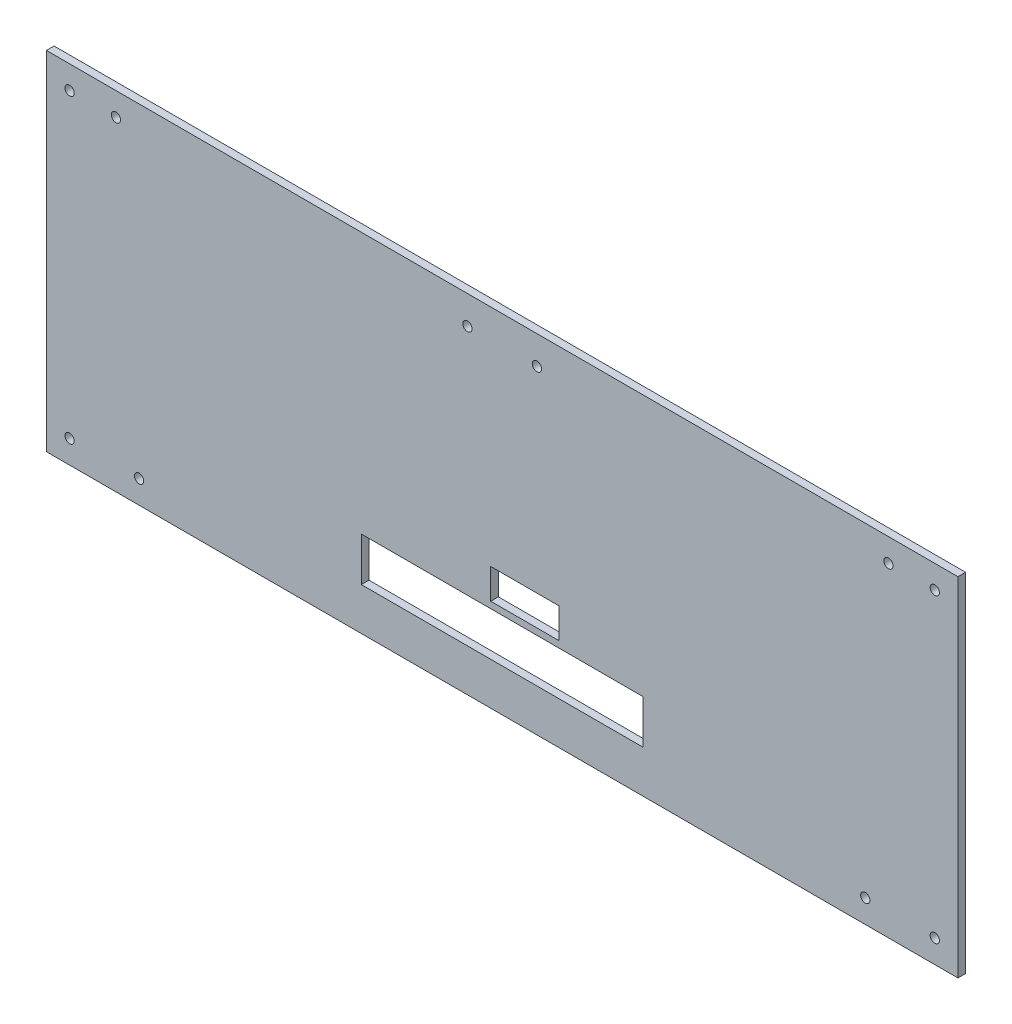
ISO-10303-21;
HEADER;
FILE_DESCRIPTION(('STEP AP214'),'2;1');
FILE_NAME('part.step','',(''),(''),'','','');
FILE_SCHEMA(('AUTOMOTIVE_DESIGN { 1 0 10303 214 1 1 1 1 }'));
ENDSEC;
DATA;
#1=APPLICATION_CONTEXT('core data for automotive mechanical design processes');
#2=APPLICATION_PROTOCOL_DEFINITION('international standard','automotive_design',2000,#1);
#3=PRODUCT_CONTEXT('',#1,'mechanical');
#4=PRODUCT('Part','Part','',(#3));
#5=PRODUCT_RELATED_PRODUCT_CATEGORY('part','',(#4));
#6=PRODUCT_DEFINITION_FORMATION('','',#4);
#7=PRODUCT_DEFINITION_CONTEXT('part definition',#1,'design');
#8=PRODUCT_DEFINITION('design','',#6,#7);
#9=PRODUCT_DEFINITION_SHAPE('','',#8);
#10=(LENGTH_UNIT() NAMED_UNIT(*) SI_UNIT(.MILLI.,.METRE.));
#11=(NAMED_UNIT(*) PLANE_ANGLE_UNIT() SI_UNIT($,.RADIAN.));
#12=(NAMED_UNIT(*) SI_UNIT($,.STERADIAN.) SOLID_ANGLE_UNIT());
#13=UNCERTAINTY_MEASURE_WITH_UNIT(LENGTH_MEASURE(1.E-05),#10,'distance_accuracy_value','');
#14=(GEOMETRIC_REPRESENTATION_CONTEXT(3) GLOBAL_UNCERTAINTY_ASSIGNED_CONTEXT((#13)) GLOBAL_UNIT_ASSIGNED_CONTEXT((#10,
#11,#12)) REPRESENTATION_CONTEXT('',''));
#15=CARTESIAN_POINT('',(0.,0.,0.));
#16=DIRECTION('',(0.,0.,1.));
#17=DIRECTION('',(1.,0.,0.));
#18=AXIS2_PLACEMENT_3D('',#15,#16,#17);
#19=CARTESIAN_POINT('',(-169.699999999996,24.5,3.3));
#20=DIRECTION('',(1.,0.,0.));
#21=DIRECTION('',(0.,1.,0.));
#22=AXIS2_PLACEMENT_3D('',#19,#20,#21);
#23=PLANE('',#22);
#24=DIRECTION('',(0.,-1.,0.));
#25=VECTOR('',#24,1.);
#26=CARTESIAN_POINT('',(-169.699999999996,24.5,0.));
#27=LINE('',#26,#25);
#28=CARTESIAN_POINT('',(-169.699999999996,24.5,0.));
#29=VERTEX_POINT('',#28);
#30=CARTESIAN_POINT('',(-169.699999999996,-125.5,0.));
#31=VERTEX_POINT('',#30);
#32=EDGE_CURVE('E230',#29,#31,#27,.T.);
#33=ORIENTED_EDGE('',*,*,#32,.T.);
#34=DIRECTION('',(0.,0.,-1.));
#35=VECTOR('',#34,1.);
#36=CARTESIAN_POINT('',(-169.699999999996,-125.5,3.3));
#37=LINE('',#36,#35);
#38=CARTESIAN_POINT('',(-169.699999999996,-125.5,3.3));
#39=VERTEX_POINT('',#38);
#40=EDGE_CURVE('E11',#39,#31,#37,.T.);
#41=ORIENTED_EDGE('',*,*,#40,.F.);
#42=DIRECTION('',(0.,-1.,0.));
#43=VECTOR('',#42,1.);
#44=CARTESIAN_POINT('',(-169.699999999996,24.5,3.3));
#45=LINE('',#44,#43);
#46=CARTESIAN_POINT('',(-169.699999999996,24.5,3.3));
#47=VERTEX_POINT('',#46);
#48=EDGE_CURVE('E233',#47,#39,#45,.T.);
#49=ORIENTED_EDGE('',*,*,#48,.F.);
#50=DIRECTION('',(0.,0.,-1.));
#51=VECTOR('',#50,1.);
#52=CARTESIAN_POINT('',(-169.699999999996,24.5,3.3));
#53=LINE('',#52,#51);
#54=EDGE_CURVE('E243',#47,#29,#53,.T.);
#55=ORIENTED_EDGE('',*,*,#54,.T.);
#56=EDGE_LOOP('',(#33,#41,#49,#55));
#57=FACE_BOUND('',#56,.T.);
#58=ADVANCED_FACE('F33',(#57),#23,.F.);
#59=CARTESIAN_POINT('',(-169.699999999996,-125.5,3.3));
#60=DIRECTION('',(0.,1.,0.));
#61=DIRECTION('',(0.,0.,1.));
#62=AXIS2_PLACEMENT_3D('',#59,#60,#61);
#63=PLANE('',#62);
#64=DIRECTION('',(1.,0.,0.));
#65=VECTOR('',#64,1.);
#66=CARTESIAN_POINT('',(-169.699999999996,-125.5,0.));
#67=LINE('',#66,#65);
#68=CARTESIAN_POINT('',(223.700000000004,-125.5,0.));
#69=VERTEX_POINT('',#68);
#70=EDGE_CURVE('E246',#31,#69,#67,.T.);
#71=ORIENTED_EDGE('',*,*,#70,.T.);
#72=DIRECTION('',(0.,0.,-1.));
#73=VECTOR('',#72,1.);
#74=CARTESIAN_POINT('',(223.700000000004,-125.5,3.3));
#75=LINE('',#74,#73);
#76=CARTESIAN_POINT('',(223.700000000004,-125.5,3.3));
#77=VERTEX_POINT('',#76);
#78=EDGE_CURVE('E41',#77,#69,#75,.T.);
#79=ORIENTED_EDGE('',*,*,#78,.F.);
#80=DIRECTION('',(1.,0.,0.));
#81=VECTOR('',#80,1.);
#82=CARTESIAN_POINT('',(-169.699999999996,-125.5,3.3));
#83=LINE('',#82,#81);
#84=EDGE_CURVE('E236',#39,#77,#83,.T.);
#85=ORIENTED_EDGE('',*,*,#84,.F.);
#86=ORIENTED_EDGE('',*,*,#40,.T.);
#87=EDGE_LOOP('',(#71,#79,#85,#86));
#88=FACE_BOUND('',#87,.T.);
#89=ADVANCED_FACE('F291',(#88),#63,.F.);
#90=CARTESIAN_POINT('',(223.700000000004,24.5,3.3));
#91=DIRECTION('',(-1.,0.,0.));
#92=DIRECTION('',(0.,-1.,0.));
#93=AXIS2_PLACEMENT_3D('',#90,#91,#92);
#94=PLANE('',#93);
#95=DIRECTION('',(0.,1.,0.));
#96=VECTOR('',#95,1.);
#97=CARTESIAN_POINT('',(223.700000000004,24.5,0.));
#98=LINE('',#97,#96);
#99=CARTESIAN_POINT('',(223.700000000004,24.5,0.));
#100=VERTEX_POINT('',#99);
#101=EDGE_CURVE('E248',#69,#100,#98,.T.);
#102=ORIENTED_EDGE('',*,*,#101,.T.);
#103=DIRECTION('',(0.,0.,-1.));
#104=VECTOR('',#103,1.);
#105=CARTESIAN_POINT('',(223.700000000004,24.5,3.3));
#106=LINE('',#105,#104);
#107=CARTESIAN_POINT('',(223.700000000004,24.5,3.3));
#108=VERTEX_POINT('',#107);
#109=EDGE_CURVE('E253',#108,#100,#106,.T.);
#110=ORIENTED_EDGE('',*,*,#109,.F.);
#111=DIRECTION('',(0.,1.,0.));
#112=VECTOR('',#111,1.);
#113=CARTESIAN_POINT('',(223.700000000004,24.5,3.3));
#114=LINE('',#113,#112);
#115=EDGE_CURVE('E239',#77,#108,#114,.T.);
#116=ORIENTED_EDGE('',*,*,#115,.F.);
#117=ORIENTED_EDGE('',*,*,#78,.T.);
#118=EDGE_LOOP('',(#102,#110,#116,#117));
#119=FACE_BOUND('',#118,.T.);
#120=ADVANCED_FACE('F296',(#119),#94,.F.);
#121=CARTESIAN_POINT('',(-169.699999999996,24.5,3.3));
#122=DIRECTION('',(0.,-1.,0.));
#123=DIRECTION('',(0.,0.,-1.));
#124=AXIS2_PLACEMENT_3D('',#121,#122,#123);
#125=PLANE('',#124);
#126=DIRECTION('',(-1.,0.,0.));
#127=VECTOR('',#126,1.);
#128=CARTESIAN_POINT('',(-169.699999999996,24.5,0.));
#129=LINE('',#128,#127);
#130=EDGE_CURVE('E237',#100,#29,#129,.T.);
#131=ORIENTED_EDGE('',*,*,#130,.T.);
#132=ORIENTED_EDGE('',*,*,#54,.F.);
#133=DIRECTION('',(-1.,0.,0.));
#134=VECTOR('',#133,1.);
#135=CARTESIAN_POINT('',(-169.699999999996,24.5,3.3));
#136=LINE('',#135,#134);
#137=EDGE_CURVE('E241',#108,#47,#136,.T.);
#138=ORIENTED_EDGE('',*,*,#137,.F.);
#139=ORIENTED_EDGE('',*,*,#109,.T.);
#140=EDGE_LOOP('',(#131,#132,#138,#139));
#141=FACE_BOUND('',#140,.T.);
#142=ADVANCED_FACE('F312',(#141),#125,.F.);
#143=CARTESIAN_POINT('',(0.,0.,3.3));
#144=DIRECTION('',(0.,0.,1.));
#145=DIRECTION('',(1.,0.,0.));
#146=AXIS2_PLACEMENT_3D('',#143,#144,#145);
#147=PLANE('',#146);
#148=DIRECTION('',(0.,1.,0.));
#149=VECTOR('',#148,1.);
#150=CARTESIAN_POINT('',(51.5500000000044,0.,3.3));
#151=LINE('',#150,#149);
#152=CARTESIAN_POINT('',(51.5500000000044,-85.4999999999981,3.3));
#153=VERTEX_POINT('',#152);
#154=CARTESIAN_POINT('',(51.5500000000044,-72.4999999999981,3.3));
#155=VERTEX_POINT('',#154);
#156=EDGE_CURVE('E185',#153,#155,#151,.T.);
#157=ORIENTED_EDGE('',*,*,#156,.F.);
#158=DIRECTION('',(1.,0.,0.));
#159=VECTOR('',#158,1.);
#160=CARTESIAN_POINT('',(0.,-85.4999999999981,3.3));
#161=LINE('',#160,#159);
#162=CARTESIAN_POINT('',(22.0500000000044,-85.4999999999981,3.3));
#163=VERTEX_POINT('',#162);
#164=EDGE_CURVE('E180',#163,#153,#161,.T.);
#165=ORIENTED_EDGE('',*,*,#164,.F.);
#166=DIRECTION('',(0.,-1.,0.));
#167=VECTOR('',#166,1.);
#168=CARTESIAN_POINT('',(22.0500000000044,0.,3.3));
#169=LINE('',#168,#167);
#170=CARTESIAN_POINT('',(22.0500000000044,-72.4999999999981,3.3));
#171=VERTEX_POINT('',#170);
#172=EDGE_CURVE('E128',#171,#163,#169,.T.);
#173=ORIENTED_EDGE('',*,*,#172,.F.);
#174=DIRECTION('',(-1.,0.,0.));
#175=VECTOR('',#174,1.);
#176=CARTESIAN_POINT('',(0.,-72.4999999999981,3.3));
#177=LINE('',#176,#175);
#178=EDGE_CURVE('E183',#155,#171,#177,.T.);
#179=ORIENTED_EDGE('',*,*,#178,.F.);
#180=EDGE_LOOP('',(#157,#165,#173,#179));
#181=FACE_BOUND('',#180,.T.);
#182=DIRECTION('',(0.,1.,0.));
#183=VECTOR('',#182,1.);
#184=CARTESIAN_POINT('',(87.7897237376353,0.,3.3));
#185=LINE('',#184,#183);
#186=CARTESIAN_POINT('',(87.7897237376353,-107.192382112363,3.3));
#187=VERTEX_POINT('',#186);
#188=CARTESIAN_POINT('',(87.7897237376353,-88.292382112363,3.3));
#189=VERTEX_POINT('',#188);
#190=EDGE_CURVE('E178',#187,#189,#185,.T.);
#191=ORIENTED_EDGE('',*,*,#190,.F.);
#192=DIRECTION('',(1.,0.,0.));
#193=VECTOR('',#192,1.);
#194=CARTESIAN_POINT('',(0.,-107.192382112363,3.3));
#195=LINE('',#194,#193);
#196=CARTESIAN_POINT('',(-33.7897237376264,-107.192382112363,3.3));
#197=VERTEX_POINT('',#196);
#198=EDGE_CURVE('E152',#197,#187,#195,.T.);
#199=ORIENTED_EDGE('',*,*,#198,.F.);
#200=DIRECTION('',(0.,-1.,0.));
#201=VECTOR('',#200,1.);
#202=CARTESIAN_POINT('',(-33.7897237376264,0.,3.3));
#203=LINE('',#202,#201);
#204=CARTESIAN_POINT('',(-33.7897237376264,-88.292382112363,3.3));
#205=VERTEX_POINT('',#204);
#206=EDGE_CURVE('E174',#205,#197,#203,.T.);
#207=ORIENTED_EDGE('',*,*,#206,.F.);
#208=DIRECTION('',(-1.,0.,0.));
#209=VECTOR('',#208,1.);
#210=CARTESIAN_POINT('',(0.,-88.292382112363,3.3));
#211=LINE('',#210,#209);
#212=EDGE_CURVE('E176',#189,#205,#211,.T.);
#213=ORIENTED_EDGE('',*,*,#212,.F.);
#214=EDGE_LOOP('',(#191,#199,#207,#213));
#215=FACE_BOUND('',#214,.T.);
#216=CARTESIAN_POINT('',(12.,12.2500000000001,3.3));
#217=DIRECTION('',(0.,0.,1.));
#218=DIRECTION('',(1.,0.,0.));
#219=AXIS2_PLACEMENT_3D('',#216,#217,#218);
#220=CIRCLE('',#219,2.);
#221=CARTESIAN_POINT('',(14.,12.2500000000001,3.3));
#222=VERTEX_POINT('',#221);
#223=EDGE_CURVE('E188',#222,#222,#220,.T.);
#224=ORIENTED_EDGE('',*,*,#223,.F.);
#225=EDGE_LOOP('',(#224));
#226=FACE_BOUND('',#225,.T.);
#227=CARTESIAN_POINT('',(42.,12.25,3.3));
#228=DIRECTION('',(0.,0.,1.));
#229=DIRECTION('',(-1.,0.,0.));
#230=AXIS2_PLACEMENT_3D('',#227,#228,#229);
#231=CIRCLE('',#230,2.);
#232=CARTESIAN_POINT('',(40.,12.25,3.3));
#233=VERTEX_POINT('',#232);
#234=EDGE_CURVE('E187',#233,#233,#231,.T.);
#235=ORIENTED_EDGE('',*,*,#234,.F.);
#236=EDGE_LOOP('',(#235));
#237=FACE_BOUND('',#236,.T.);
#238=CARTESIAN_POINT('',(-159.699999999996,14.5,3.3));
#239=DIRECTION('',(0.,0.,1.));
#240=DIRECTION('',(1.,0.,0.));
#241=AXIS2_PLACEMENT_3D('',#238,#239,#240);
#242=CIRCLE('',#241,2.);
#243=CARTESIAN_POINT('',(-157.699999999996,14.5,3.3));
#244=VERTEX_POINT('',#243);
#245=EDGE_CURVE('E194',#244,#244,#242,.T.);
#246=ORIENTED_EDGE('',*,*,#245,.F.);
#247=EDGE_LOOP('',(#246));
#248=FACE_BOUND('',#247,.T.);
#249=CARTESIAN_POINT('',(-139.699999999996,14.5,3.3));
#250=DIRECTION('',(0.,0.,1.));
#251=DIRECTION('',(1.,0.,0.));
#252=AXIS2_PLACEMENT_3D('',#249,#250,#251);
#253=CIRCLE('',#252,2.);
#254=CARTESIAN_POINT('',(-137.699999999996,14.5,3.3));
#255=VERTEX_POINT('',#254);
#256=EDGE_CURVE('E198',#255,#255,#253,.T.);
#257=ORIENTED_EDGE('',*,*,#256,.F.);
#258=EDGE_LOOP('',(#257));
#259=FACE_BOUND('',#258,.T.);
#260=CARTESIAN_POINT('',(193.700000000004,14.5,3.3));
#261=DIRECTION('',(0.,0.,1.));
#262=DIRECTION('',(-1.,0.,0.));
#263=AXIS2_PLACEMENT_3D('',#260,#261,#262);
#264=CIRCLE('',#263,2.);
#265=CARTESIAN_POINT('',(191.700000000004,14.5,3.3));
#266=VERTEX_POINT('',#265);
#267=EDGE_CURVE('E201',#266,#266,#264,.T.);
#268=ORIENTED_EDGE('',*,*,#267,.F.);
#269=EDGE_LOOP('',(#268));
#270=FACE_BOUND('',#269,.T.);
#271=CARTESIAN_POINT('',(213.700000000004,14.5,3.3));
#272=DIRECTION('',(0.,0.,1.));
#273=DIRECTION('',(-1.,0.,0.));
#274=AXIS2_PLACEMENT_3D('',#271,#272,#273);
#275=CIRCLE('',#274,2.);
#276=CARTESIAN_POINT('',(211.700000000004,14.5,3.3));
#277=VERTEX_POINT('',#276);
#278=EDGE_CURVE('E204',#277,#277,#275,.T.);
#279=ORIENTED_EDGE('',*,*,#278,.F.);
#280=EDGE_LOOP('',(#279));
#281=FACE_BOUND('',#280,.T.);
#282=CARTESIAN_POINT('',(-159.699999999995,-115.5,3.3));
#283=DIRECTION('',(0.,0.,-1.));
#284=DIRECTION('',(-1.,0.,0.));
#285=AXIS2_PLACEMENT_3D('',#282,#283,#284);
#286=CIRCLE('',#285,2.);
#287=CARTESIAN_POINT('',(-161.699999999995,-115.5,3.3));
#288=VERTEX_POINT('',#287);
#289=EDGE_CURVE('E220',#288,#288,#286,.T.);
#290=ORIENTED_EDGE('',*,*,#289,.T.);
#291=EDGE_LOOP('',(#290));
#292=FACE_BOUND('',#291,.T.);
#293=CARTESIAN_POINT('',(-129.699999999995,-115.5,3.3));
#294=DIRECTION('',(0.,0.,-1.));
#295=DIRECTION('',(-1.,0.,0.));
#296=AXIS2_PLACEMENT_3D('',#293,#294,#295);
#297=CIRCLE('',#296,2.);
#298=CARTESIAN_POINT('',(-131.699999999995,-115.5,3.3));
#299=VERTEX_POINT('',#298);
#300=EDGE_CURVE('E214',#299,#299,#297,.T.);
#301=ORIENTED_EDGE('',*,*,#300,.T.);
#302=EDGE_LOOP('',(#301));
#303=FACE_BOUND('',#302,.T.);
#304=CARTESIAN_POINT('',(213.700000000004,-115.5,3.3));
#305=DIRECTION('',(0.,0.,-1.));
#306=DIRECTION('',(-1.,0.,0.));
#307=AXIS2_PLACEMENT_3D('',#304,#305,#306);
#308=CIRCLE('',#307,2.00000000000003);
#309=CARTESIAN_POINT('',(211.700000000004,-115.5,3.3));
#310=VERTEX_POINT('',#309);
#311=EDGE_CURVE('E207',#310,#310,#308,.T.);
#312=ORIENTED_EDGE('',*,*,#311,.T.);
#313=EDGE_LOOP('',(#312));
#314=FACE_BOUND('',#313,.T.);
#315=CARTESIAN_POINT('',(183.700000000004,-115.5,3.3));
#316=DIRECTION('',(0.,0.,-1.));
#317=DIRECTION('',(-1.,0.,0.));
#318=AXIS2_PLACEMENT_3D('',#315,#316,#317);
#319=CIRCLE('',#318,2.00000000000002);
#320=CARTESIAN_POINT('',(181.700000000004,-115.5,3.3));
#321=VERTEX_POINT('',#320);
#322=EDGE_CURVE('E227',#321,#321,#319,.T.);
#323=ORIENTED_EDGE('',*,*,#322,.T.);
#324=EDGE_LOOP('',(#323));
#325=FACE_BOUND('',#324,.T.);
#326=ORIENTED_EDGE('',*,*,#48,.T.);
#327=ORIENTED_EDGE('',*,*,#84,.T.);
#328=ORIENTED_EDGE('',*,*,#115,.T.);
#329=ORIENTED_EDGE('',*,*,#137,.T.);
#330=EDGE_LOOP('',(#326,#327,#328,#329));
#331=FACE_BOUND('',#330,.T.);
#332=ADVANCED_FACE('F308',(#181,#215,#226,#237,#248,#259,#270,#281,#292,#303,#314,#325,#331),
#147,.T.);
#333=CARTESIAN_POINT('',(0.,0.,0.));
#334=DIRECTION('',(0.,0.,1.));
#335=DIRECTION('',(1.,0.,0.));
#336=AXIS2_PLACEMENT_3D('',#333,#334,#335);
#337=PLANE('',#336);
#338=DIRECTION('',(-1.,0.,0.));
#339=VECTOR('',#338,1.);
#340=CARTESIAN_POINT('',(51.5500000000044,-85.4999999999981,0.));
#341=LINE('',#340,#339);
#342=CARTESIAN_POINT('',(51.5500000000044,-85.4999999999981,0.));
#343=VERTEX_POINT('',#342);
#344=CARTESIAN_POINT('',(22.0500000000044,-85.4999999999981,0.));
#345=VERTEX_POINT('',#344);
#346=EDGE_CURVE('E135',#343,#345,#341,.T.);
#347=ORIENTED_EDGE('',*,*,#346,.F.);
#348=DIRECTION('',(0.,-1.,0.));
#349=VECTOR('',#348,1.);
#350=CARTESIAN_POINT('',(51.5500000000044,-72.4999999999981,0.));
#351=LINE('',#350,#349);
#352=CARTESIAN_POINT('',(51.5500000000044,-72.4999999999981,0.));
#353=VERTEX_POINT('',#352);
#354=EDGE_CURVE('E140',#353,#343,#351,.T.);
#355=ORIENTED_EDGE('',*,*,#354,.F.);
#356=DIRECTION('',(1.,0.,0.));
#357=VECTOR('',#356,1.);
#358=CARTESIAN_POINT('',(51.5500000000044,-72.4999999999981,0.));
#359=LINE('',#358,#357);
#360=CARTESIAN_POINT('',(22.0500000000044,-72.4999999999981,0.));
#361=VERTEX_POINT('',#360);
#362=EDGE_CURVE('E145',#361,#353,#359,.T.);
#363=ORIENTED_EDGE('',*,*,#362,.F.);
#364=DIRECTION('',(0.,1.,0.));
#365=VECTOR('',#364,1.);
#366=CARTESIAN_POINT('',(22.0500000000044,-72.4999999999981,0.));
#367=LINE('',#366,#365);
#368=EDGE_CURVE('E125',#345,#361,#367,.T.);
#369=ORIENTED_EDGE('',*,*,#368,.F.);
#370=EDGE_LOOP('',(#347,#355,#363,#369));
#371=FACE_BOUND('',#370,.T.);
#372=DIRECTION('',(-1.,0.,0.));
#373=VECTOR('',#372,1.);
#374=CARTESIAN_POINT('',(87.7897237376353,-107.192382112363,0.));
#375=LINE('',#374,#373);
#376=CARTESIAN_POINT('',(87.7897237376353,-107.192382112363,0.));
#377=VERTEX_POINT('',#376);
#378=CARTESIAN_POINT('',(-33.7897237376264,-107.192382112363,0.));
#379=VERTEX_POINT('',#378);
#380=EDGE_CURVE('E157',#377,#379,#375,.T.);
#381=ORIENTED_EDGE('',*,*,#380,.F.);
#382=DIRECTION('',(0.,-1.,0.));
#383=VECTOR('',#382,1.);
#384=CARTESIAN_POINT('',(87.7897237376353,-88.292382112363,0.));
#385=LINE('',#384,#383);
#386=CARTESIAN_POINT('',(87.7897237376353,-88.292382112363,0.));
#387=VERTEX_POINT('',#386);
#388=EDGE_CURVE('E155',#387,#377,#385,.T.);
#389=ORIENTED_EDGE('',*,*,#388,.F.);
#390=DIRECTION('',(1.,0.,0.));
#391=VECTOR('',#390,1.);
#392=CARTESIAN_POINT('',(87.7897237376353,-88.292382112363,0.));
#393=LINE('',#392,#391);
#394=CARTESIAN_POINT('',(-33.7897237376264,-88.292382112363,0.));
#395=VERTEX_POINT('',#394);
#396=EDGE_CURVE('E162',#395,#387,#393,.T.);
#397=ORIENTED_EDGE('',*,*,#396,.F.);
#398=DIRECTION('',(0.,1.,0.));
#399=VECTOR('',#398,1.);
#400=CARTESIAN_POINT('',(-33.7897237376264,-88.292382112363,0.));
#401=LINE('',#400,#399);
#402=EDGE_CURVE('E159',#379,#395,#401,.T.);
#403=ORIENTED_EDGE('',*,*,#402,.F.);
#404=EDGE_LOOP('',(#381,#389,#397,#403));
#405=FACE_BOUND('',#404,.T.);
#406=CARTESIAN_POINT('',(12.,12.2500000000001,0.));
#407=DIRECTION('',(0.,0.,1.));
#408=DIRECTION('',(1.,0.,0.));
#409=AXIS2_PLACEMENT_3D('',#406,#407,#408);
#410=CIRCLE('',#409,2.);
#411=CARTESIAN_POINT('',(14.,12.2500000000001,0.));
#412=VERTEX_POINT('',#411);
#413=EDGE_CURVE('E36',#412,#412,#410,.T.);
#414=ORIENTED_EDGE('',*,*,#413,.T.);
#415=EDGE_LOOP('',(#414));
#416=FACE_BOUND('',#415,.T.);
#417=CARTESIAN_POINT('',(42.,12.25,0.));
#418=DIRECTION('',(0.,0.,1.));
#419=DIRECTION('',(1.,0.,0.));
#420=AXIS2_PLACEMENT_3D('',#417,#418,#419);
#421=CIRCLE('',#420,2.);
#422=CARTESIAN_POINT('',(44.,12.25,0.));
#423=VERTEX_POINT('',#422);
#424=EDGE_CURVE('E191',#423,#423,#421,.T.);
#425=ORIENTED_EDGE('',*,*,#424,.T.);
#426=EDGE_LOOP('',(#425));
#427=FACE_BOUND('',#426,.T.);
#428=CARTESIAN_POINT('',(-159.699999999996,14.5,0.));
#429=DIRECTION('',(0.,0.,1.));
#430=DIRECTION('',(1.,0.,0.));
#431=AXIS2_PLACEMENT_3D('',#428,#429,#430);
#432=CIRCLE('',#431,2.);
#433=CARTESIAN_POINT('',(-157.699999999996,14.5,0.));
#434=VERTEX_POINT('',#433);
#435=EDGE_CURVE('E226',#434,#434,#432,.T.);
#436=ORIENTED_EDGE('',*,*,#435,.T.);
#437=EDGE_LOOP('',(#436));
#438=FACE_BOUND('',#437,.T.);
#439=CARTESIAN_POINT('',(-139.699999999996,14.5,0.));
#440=DIRECTION('',(0.,0.,1.));
#441=DIRECTION('',(1.,0.,0.));
#442=AXIS2_PLACEMENT_3D('',#439,#440,#441);
#443=CIRCLE('',#442,2.);
#444=CARTESIAN_POINT('',(-137.699999999996,14.5,0.));
#445=VERTEX_POINT('',#444);
#446=EDGE_CURVE('E263',#445,#445,#443,.T.);
#447=ORIENTED_EDGE('',*,*,#446,.T.);
#448=EDGE_LOOP('',(#447));
#449=FACE_BOUND('',#448,.T.);
#450=CARTESIAN_POINT('',(193.700000000004,14.5,0.));
#451=DIRECTION('',(0.,0.,1.));
#452=DIRECTION('',(1.,0.,0.));
#453=AXIS2_PLACEMENT_3D('',#450,#451,#452);
#454=CIRCLE('',#453,2.);
#455=CARTESIAN_POINT('',(195.700000000004,14.5,0.));
#456=VERTEX_POINT('',#455);
#457=EDGE_CURVE('E260',#456,#456,#454,.T.);
#458=ORIENTED_EDGE('',*,*,#457,.T.);
#459=EDGE_LOOP('',(#458));
#460=FACE_BOUND('',#459,.T.);
#461=CARTESIAN_POINT('',(213.700000000004,14.5,0.));
#462=DIRECTION('',(0.,0.,1.));
#463=DIRECTION('',(1.,0.,0.));
#464=AXIS2_PLACEMENT_3D('',#461,#462,#463);
#465=CIRCLE('',#464,2.);
#466=CARTESIAN_POINT('',(215.700000000004,14.5,0.));
#467=VERTEX_POINT('',#466);
#468=EDGE_CURVE('E197',#467,#467,#465,.T.);
#469=ORIENTED_EDGE('',*,*,#468,.T.);
#470=EDGE_LOOP('',(#469));
#471=FACE_BOUND('',#470,.T.);
#472=CARTESIAN_POINT('',(-159.699999999995,-115.5,0.));
#473=DIRECTION('',(0.,0.,-1.));
#474=DIRECTION('',(-1.,0.,0.));
#475=AXIS2_PLACEMENT_3D('',#472,#473,#474);
#476=CIRCLE('',#475,2.);
#477=CARTESIAN_POINT('',(-161.699999999995,-115.5,0.));
#478=VERTEX_POINT('',#477);
#479=EDGE_CURVE('E223',#478,#478,#476,.T.);
#480=ORIENTED_EDGE('',*,*,#479,.F.);
#481=EDGE_LOOP('',(#480));
#482=FACE_BOUND('',#481,.T.);
#483=CARTESIAN_POINT('',(-129.699999999995,-115.5,0.));
#484=DIRECTION('',(0.,0.,-1.));
#485=DIRECTION('',(-1.,0.,0.));
#486=AXIS2_PLACEMENT_3D('',#483,#484,#485);
#487=CIRCLE('',#486,2.);
#488=CARTESIAN_POINT('',(-131.699999999995,-115.5,0.));
#489=VERTEX_POINT('',#488);
#490=EDGE_CURVE('E217',#489,#489,#487,.T.);
#491=ORIENTED_EDGE('',*,*,#490,.F.);
#492=EDGE_LOOP('',(#491));
#493=FACE_BOUND('',#492,.T.);
#494=CARTESIAN_POINT('',(213.700000000004,-115.5,0.));
#495=DIRECTION('',(0.,0.,-1.));
#496=DIRECTION('',(-1.,0.,0.));
#497=AXIS2_PLACEMENT_3D('',#494,#495,#496);
#498=CIRCLE('',#497,2.00000000000003);
#499=CARTESIAN_POINT('',(211.700000000004,-115.5,0.));
#500=VERTEX_POINT('',#499);
#501=EDGE_CURVE('E211',#500,#500,#498,.T.);
#502=ORIENTED_EDGE('',*,*,#501,.F.);
#503=EDGE_LOOP('',(#502));
#504=FACE_BOUND('',#503,.T.);
#505=CARTESIAN_POINT('',(183.700000000004,-115.5,0.));
#506=DIRECTION('',(0.,0.,-1.));
#507=DIRECTION('',(-1.,0.,0.));
#508=AXIS2_PLACEMENT_3D('',#505,#506,#507);
#509=CIRCLE('',#508,2.00000000000002);
#510=CARTESIAN_POINT('',(181.700000000004,-115.5,0.));
#511=VERTEX_POINT('',#510);
#512=EDGE_CURVE('E210',#511,#511,#509,.T.);
#513=ORIENTED_EDGE('',*,*,#512,.F.);
#514=EDGE_LOOP('',(#513));
#515=FACE_BOUND('',#514,.T.);
#516=ORIENTED_EDGE('',*,*,#32,.F.);
#517=ORIENTED_EDGE('',*,*,#130,.F.);
#518=ORIENTED_EDGE('',*,*,#101,.F.);
#519=ORIENTED_EDGE('',*,*,#70,.F.);
#520=EDGE_LOOP('',(#516,#517,#518,#519));
#521=FACE_BOUND('',#520,.T.);
#522=ADVANCED_FACE('F142',(#371,#405,#416,#427,#438,#449,#460,#471,#482,#493,#504,#515,#521),
#337,.F.);
#523=CARTESIAN_POINT('',(183.700000000004,-115.5,3.3));
#524=DIRECTION('',(0.,0.,-1.));
#525=DIRECTION('',(-1.,0.,0.));
#526=AXIS2_PLACEMENT_3D('',#523,#524,#525);
#527=CYLINDRICAL_SURFACE('',#526,2.00000000000002);
#528=ORIENTED_EDGE('',*,*,#322,.F.);
#529=EDGE_LOOP('',(#528));
#530=FACE_BOUND('',#529,.T.);
#531=ORIENTED_EDGE('',*,*,#512,.T.);
#532=EDGE_LOOP('',(#531));
#533=FACE_BOUND('',#532,.T.);
#534=ADVANCED_FACE('F323',(#530,#533),#527,.F.);
#535=CARTESIAN_POINT('',(213.700000000004,-115.5,3.3));
#536=DIRECTION('',(0.,0.,-1.));
#537=DIRECTION('',(-1.,0.,0.));
#538=AXIS2_PLACEMENT_3D('',#535,#536,#537);
#539=CYLINDRICAL_SURFACE('',#538,2.00000000000003);
#540=ORIENTED_EDGE('',*,*,#311,.F.);
#541=EDGE_LOOP('',(#540));
#542=FACE_BOUND('',#541,.T.);
#543=ORIENTED_EDGE('',*,*,#501,.T.);
#544=EDGE_LOOP('',(#543));
#545=FACE_BOUND('',#544,.T.);
#546=ADVANCED_FACE('F329',(#542,#545),#539,.F.);
#547=CARTESIAN_POINT('',(-129.699999999995,-115.5,3.3));
#548=DIRECTION('',(0.,0.,-1.));
#549=DIRECTION('',(-1.,0.,0.));
#550=AXIS2_PLACEMENT_3D('',#547,#548,#549);
#551=CYLINDRICAL_SURFACE('',#550,2.);
#552=ORIENTED_EDGE('',*,*,#300,.F.);
#553=EDGE_LOOP('',(#552));
#554=FACE_BOUND('',#553,.T.);
#555=ORIENTED_EDGE('',*,*,#490,.T.);
#556=EDGE_LOOP('',(#555));
#557=FACE_BOUND('',#556,.T.);
#558=ADVANCED_FACE('F335',(#554,#557),#551,.F.);
#559=CARTESIAN_POINT('',(-159.699999999995,-115.5,3.3));
#560=DIRECTION('',(0.,0.,-1.));
#561=DIRECTION('',(-1.,0.,0.));
#562=AXIS2_PLACEMENT_3D('',#559,#560,#561);
#563=CYLINDRICAL_SURFACE('',#562,2.);
#564=ORIENTED_EDGE('',*,*,#289,.F.);
#565=EDGE_LOOP('',(#564));
#566=FACE_BOUND('',#565,.T.);
#567=ORIENTED_EDGE('',*,*,#479,.T.);
#568=EDGE_LOOP('',(#567));
#569=FACE_BOUND('',#568,.T.);
#570=ADVANCED_FACE('F331',(#566,#569),#563,.F.);
#571=CARTESIAN_POINT('',(213.700000000004,14.5,-0.7));
#572=DIRECTION('',(0.,0.,1.));
#573=DIRECTION('',(1.,0.,0.));
#574=AXIS2_PLACEMENT_3D('',#571,#572,#573);
#575=CYLINDRICAL_SURFACE('',#574,2.);
#576=ORIENTED_EDGE('',*,*,#278,.T.);
#577=EDGE_LOOP('',(#576));
#578=FACE_BOUND('',#577,.T.);
#579=ORIENTED_EDGE('',*,*,#468,.F.);
#580=EDGE_LOOP('',(#579));
#581=FACE_BOUND('',#580,.T.);
#582=ADVANCED_FACE('F334',(#578,#581),#575,.F.);
#583=CARTESIAN_POINT('',(193.700000000004,14.5,-0.7));
#584=DIRECTION('',(0.,0.,1.));
#585=DIRECTION('',(1.,0.,0.));
#586=AXIS2_PLACEMENT_3D('',#583,#584,#585);
#587=CYLINDRICAL_SURFACE('',#586,2.);
#588=ORIENTED_EDGE('',*,*,#267,.T.);
#589=EDGE_LOOP('',(#588));
#590=FACE_BOUND('',#589,.T.);
#591=ORIENTED_EDGE('',*,*,#457,.F.);
#592=EDGE_LOOP('',(#591));
#593=FACE_BOUND('',#592,.T.);
#594=ADVANCED_FACE('F345',(#590,#593),#587,.F.);
#595=CARTESIAN_POINT('',(-139.699999999996,14.5,-0.7));
#596=DIRECTION('',(0.,0.,1.));
#597=DIRECTION('',(1.,0.,0.));
#598=AXIS2_PLACEMENT_3D('',#595,#596,#597);
#599=CYLINDRICAL_SURFACE('',#598,2.);
#600=ORIENTED_EDGE('',*,*,#256,.T.);
#601=EDGE_LOOP('',(#600));
#602=FACE_BOUND('',#601,.T.);
#603=ORIENTED_EDGE('',*,*,#446,.F.);
#604=EDGE_LOOP('',(#603));
#605=FACE_BOUND('',#604,.T.);
#606=ADVANCED_FACE('F349',(#602,#605),#599,.F.);
#607=CARTESIAN_POINT('',(-159.699999999996,14.5,-0.7));
#608=DIRECTION('',(0.,0.,1.));
#609=DIRECTION('',(1.,0.,0.));
#610=AXIS2_PLACEMENT_3D('',#607,#608,#609);
#611=CYLINDRICAL_SURFACE('',#610,2.);
#612=ORIENTED_EDGE('',*,*,#245,.T.);
#613=EDGE_LOOP('',(#612));
#614=FACE_BOUND('',#613,.T.);
#615=ORIENTED_EDGE('',*,*,#435,.F.);
#616=EDGE_LOOP('',(#615));
#617=FACE_BOUND('',#616,.T.);
#618=ADVANCED_FACE('F287',(#614,#617),#611,.F.);
#619=CARTESIAN_POINT('',(42.,12.25,-0.7));
#620=DIRECTION('',(0.,0.,1.));
#621=DIRECTION('',(1.,0.,0.));
#622=AXIS2_PLACEMENT_3D('',#619,#620,#621);
#623=CYLINDRICAL_SURFACE('',#622,2.);
#624=ORIENTED_EDGE('',*,*,#234,.T.);
#625=EDGE_LOOP('',(#624));
#626=FACE_BOUND('',#625,.T.);
#627=ORIENTED_EDGE('',*,*,#424,.F.);
#628=EDGE_LOOP('',(#627));
#629=FACE_BOUND('',#628,.T.);
#630=ADVANCED_FACE('F277',(#626,#629),#623,.F.);
#631=CARTESIAN_POINT('',(12.,12.2500000000001,-0.7));
#632=DIRECTION('',(0.,0.,1.));
#633=DIRECTION('',(1.,0.,0.));
#634=AXIS2_PLACEMENT_3D('',#631,#632,#633);
#635=CYLINDRICAL_SURFACE('',#634,2.);
#636=ORIENTED_EDGE('',*,*,#223,.T.);
#637=EDGE_LOOP('',(#636));
#638=FACE_BOUND('',#637,.T.);
#639=ORIENTED_EDGE('',*,*,#413,.F.);
#640=EDGE_LOOP('',(#639));
#641=FACE_BOUND('',#640,.T.);
#642=ADVANCED_FACE('F274',(#638,#641),#635,.F.);
#643=CARTESIAN_POINT('',(87.7897237376353,-88.292382112363,10.));
#644=DIRECTION('',(1.,0.,0.));
#645=DIRECTION('',(0.,0.,-1.));
#646=AXIS2_PLACEMENT_3D('',#643,#644,#645);
#647=PLANE('',#646);
#648=ORIENTED_EDGE('',*,*,#190,.T.);
#649=DIRECTION('',(0.,0.,-1.));
#650=VECTOR('',#649,1.);
#651=CARTESIAN_POINT('',(87.7897237376353,-88.292382112363,10.));
#652=LINE('',#651,#650);
#653=EDGE_CURVE('E166',#189,#387,#652,.T.);
#654=ORIENTED_EDGE('',*,*,#653,.T.);
#655=ORIENTED_EDGE('',*,*,#388,.T.);
#656=DIRECTION('',(0.,0.,-1.));
#657=VECTOR('',#656,1.);
#658=CARTESIAN_POINT('',(87.7897237376353,-107.192382112363,10.));
#659=LINE('',#658,#657);
#660=EDGE_CURVE('E165',#187,#377,#659,.T.);
#661=ORIENTED_EDGE('',*,*,#660,.F.);
#662=EDGE_LOOP('',(#648,#654,#655,#661));
#663=FACE_BOUND('',#662,.T.);
#664=ADVANCED_FACE('F276',(#663),#647,.F.);
#665=CARTESIAN_POINT('',(87.7897237376353,-88.292382112363,10.));
#666=DIRECTION('',(0.,1.,0.));
#667=DIRECTION('',(0.,0.,1.));
#668=AXIS2_PLACEMENT_3D('',#665,#666,#667);
#669=PLANE('',#668);
#670=ORIENTED_EDGE('',*,*,#212,.T.);
#671=DIRECTION('',(0.,0.,-1.));
#672=VECTOR('',#671,1.);
#673=CARTESIAN_POINT('',(-33.7897237376264,-88.292382112363,10.));
#674=LINE('',#673,#672);
#675=EDGE_CURVE('E168',#205,#395,#674,.T.);
#676=ORIENTED_EDGE('',*,*,#675,.T.);
#677=ORIENTED_EDGE('',*,*,#396,.T.);
#678=ORIENTED_EDGE('',*,*,#653,.F.);
#679=EDGE_LOOP('',(#670,#676,#677,#678));
#680=FACE_BOUND('',#679,.T.);
#681=ADVANCED_FACE('F284',(#680),#669,.F.);
#682=CARTESIAN_POINT('',(-33.7897237376264,-88.292382112363,10.));
#683=DIRECTION('',(-1.,0.,0.));
#684=DIRECTION('',(0.,0.,1.));
#685=AXIS2_PLACEMENT_3D('',#682,#683,#684);
#686=PLANE('',#685);
#687=ORIENTED_EDGE('',*,*,#206,.T.);
#688=DIRECTION('',(0.,0.,-1.));
#689=VECTOR('',#688,1.);
#690=CARTESIAN_POINT('',(-33.7897237376264,-107.192382112363,10.));
#691=LINE('',#690,#689);
#692=EDGE_CURVE('E57',#197,#379,#691,.T.);
#693=ORIENTED_EDGE('',*,*,#692,.T.);
#694=ORIENTED_EDGE('',*,*,#402,.T.);
#695=ORIENTED_EDGE('',*,*,#675,.F.);
#696=EDGE_LOOP('',(#687,#693,#694,#695));
#697=FACE_BOUND('',#696,.T.);
#698=ADVANCED_FACE('F437',(#697),#686,.F.);
#699=CARTESIAN_POINT('',(87.7897237376353,-107.192382112363,10.));
#700=DIRECTION('',(0.,-1.,0.));
#701=DIRECTION('',(0.,0.,-1.));
#702=AXIS2_PLACEMENT_3D('',#699,#700,#701);
#703=PLANE('',#702);
#704=ORIENTED_EDGE('',*,*,#198,.T.);
#705=ORIENTED_EDGE('',*,*,#660,.T.);
#706=ORIENTED_EDGE('',*,*,#380,.T.);
#707=ORIENTED_EDGE('',*,*,#692,.F.);
#708=EDGE_LOOP('',(#704,#705,#706,#707));
#709=FACE_BOUND('',#708,.T.);
#710=ADVANCED_FACE('F447',(#709),#703,.F.);
#711=CARTESIAN_POINT('',(51.5500000000044,-72.4999999999981,10.));
#712=DIRECTION('',(1.,0.,0.));
#713=DIRECTION('',(0.,0.,-1.));
#714=AXIS2_PLACEMENT_3D('',#711,#712,#713);
#715=PLANE('',#714);
#716=ORIENTED_EDGE('',*,*,#156,.T.);
#717=DIRECTION('',(0.,0.,-1.));
#718=VECTOR('',#717,1.);
#719=CARTESIAN_POINT('',(51.5500000000044,-72.4999999999981,10.));
#720=LINE('',#719,#718);
#721=EDGE_CURVE('E150',#155,#353,#720,.T.);
#722=ORIENTED_EDGE('',*,*,#721,.T.);
#723=ORIENTED_EDGE('',*,*,#354,.T.);
#724=DIRECTION('',(0.,0.,-1.));
#725=VECTOR('',#724,1.);
#726=CARTESIAN_POINT('',(51.5500000000044,-85.4999999999981,10.));
#727=LINE('',#726,#725);
#728=EDGE_CURVE('E131',#153,#343,#727,.T.);
#729=ORIENTED_EDGE('',*,*,#728,.F.);
#730=EDGE_LOOP('',(#716,#722,#723,#729));
#731=FACE_BOUND('',#730,.T.);
#732=ADVANCED_FACE('F457',(#731),#715,.F.);
#733=CARTESIAN_POINT('',(51.5500000000044,-72.4999999999981,10.));
#734=DIRECTION('',(0.,1.,0.));
#735=DIRECTION('',(0.,0.,1.));
#736=AXIS2_PLACEMENT_3D('',#733,#734,#735);
#737=PLANE('',#736);
#738=ORIENTED_EDGE('',*,*,#178,.T.);
#739=DIRECTION('',(0.,0.,-1.));
#740=VECTOR('',#739,1.);
#741=CARTESIAN_POINT('',(22.0500000000044,-72.4999999999981,10.));
#742=LINE('',#741,#740);
#743=EDGE_CURVE('E130',#171,#361,#742,.T.);
#744=ORIENTED_EDGE('',*,*,#743,.T.);
#745=ORIENTED_EDGE('',*,*,#362,.T.);
#746=ORIENTED_EDGE('',*,*,#721,.F.);
#747=EDGE_LOOP('',(#738,#744,#745,#746));
#748=FACE_BOUND('',#747,.T.);
#749=ADVANCED_FACE('F466',(#748),#737,.F.);
#750=CARTESIAN_POINT('',(22.0500000000044,-72.4999999999981,10.));
#751=DIRECTION('',(-1.,0.,0.));
#752=DIRECTION('',(0.,0.,1.));
#753=AXIS2_PLACEMENT_3D('',#750,#751,#752);
#754=PLANE('',#753);
#755=ORIENTED_EDGE('',*,*,#172,.T.);
#756=DIRECTION('',(0.,0.,-1.));
#757=VECTOR('',#756,1.);
#758=CARTESIAN_POINT('',(22.0500000000044,-85.4999999999981,10.));
#759=LINE('',#758,#757);
#760=EDGE_CURVE('E49',#163,#345,#759,.T.);
#761=ORIENTED_EDGE('',*,*,#760,.T.);
#762=ORIENTED_EDGE('',*,*,#368,.T.);
#763=ORIENTED_EDGE('',*,*,#743,.F.);
#764=EDGE_LOOP('',(#755,#761,#762,#763));
#765=FACE_BOUND('',#764,.T.);
#766=ADVANCED_FACE('F122',(#765),#754,.F.);
#767=CARTESIAN_POINT('',(51.5500000000044,-85.4999999999981,10.));
#768=DIRECTION('',(0.,-1.,0.));
#769=DIRECTION('',(0.,0.,-1.));
#770=AXIS2_PLACEMENT_3D('',#767,#768,#769);
#771=PLANE('',#770);
#772=ORIENTED_EDGE('',*,*,#164,.T.);
#773=ORIENTED_EDGE('',*,*,#728,.T.);
#774=ORIENTED_EDGE('',*,*,#346,.T.);
#775=ORIENTED_EDGE('',*,*,#760,.F.);
#776=EDGE_LOOP('',(#772,#773,#774,#775));
#777=FACE_BOUND('',#776,.T.);
#778=ADVANCED_FACE('F136',(#777),#771,.F.);
#779=CLOSED_SHELL('',(#58,#89,#120,#142,#332,#522,#534,#546,#558,#570,#582,#594,#606,#618,#630,
#642,#664,#681,#698,#710,#732,#749,#766,#778));
#780=MANIFOLD_SOLID_BREP('B2',#779);
#781=ADVANCED_BREP_SHAPE_REPRESENTATION('',(#18,#780),#14);
#782=SHAPE_DEFINITION_REPRESENTATION(#9,#781);
ENDSEC;
END-ISO-10303-21;
